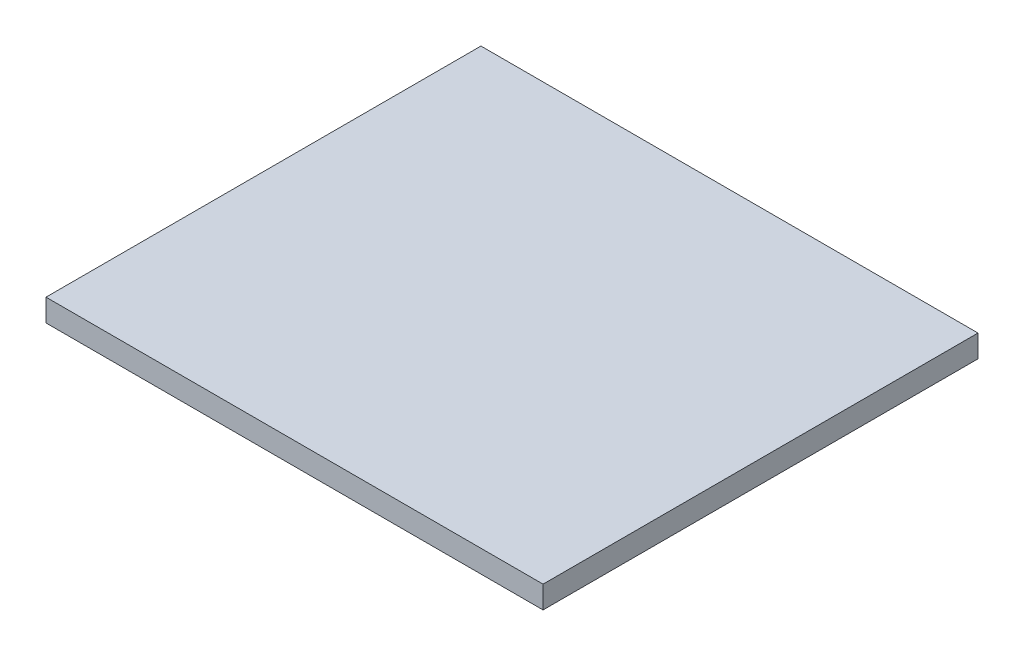
ISO-10303-21;
HEADER;
FILE_DESCRIPTION(('STEP AP214'),'2;1');
FILE_NAME('part.step','',(''),(''),'','','');
FILE_SCHEMA(('AUTOMOTIVE_DESIGN { 1 0 10303 214 1 1 1 1 }'));
ENDSEC;
DATA;
#1=APPLICATION_CONTEXT('core data for automotive mechanical design processes');
#2=APPLICATION_PROTOCOL_DEFINITION('international standard','automotive_design',2000,#1);
#3=PRODUCT_CONTEXT('',#1,'mechanical');
#4=PRODUCT('Part','Part','',(#3));
#5=PRODUCT_RELATED_PRODUCT_CATEGORY('part','',(#4));
#6=PRODUCT_DEFINITION_FORMATION('','',#4);
#7=PRODUCT_DEFINITION_CONTEXT('part definition',#1,'design');
#8=PRODUCT_DEFINITION('design','',#6,#7);
#9=PRODUCT_DEFINITION_SHAPE('','',#8);
#10=(LENGTH_UNIT() NAMED_UNIT(*) SI_UNIT(.MILLI.,.METRE.));
#11=(NAMED_UNIT(*) PLANE_ANGLE_UNIT() SI_UNIT($,.RADIAN.));
#12=(NAMED_UNIT(*) SI_UNIT($,.STERADIAN.) SOLID_ANGLE_UNIT());
#13=UNCERTAINTY_MEASURE_WITH_UNIT(LENGTH_MEASURE(1.E-05),#10,'distance_accuracy_value','');
#14=(GEOMETRIC_REPRESENTATION_CONTEXT(3) GLOBAL_UNCERTAINTY_ASSIGNED_CONTEXT((#13)) GLOBAL_UNIT_ASSIGNED_CONTEXT((#10,
#11,#12)) REPRESENTATION_CONTEXT('',''));
#15=CARTESIAN_POINT('',(0.,0.,0.));
#16=DIRECTION('',(0.,0.,1.));
#17=DIRECTION('',(1.,0.,0.));
#18=AXIS2_PLACEMENT_3D('',#15,#16,#17);
#19=CARTESIAN_POINT('',(200.,18.,-175.));
#20=DIRECTION('',(-1.,0.,0.));
#21=DIRECTION('',(0.,0.,1.));
#22=AXIS2_PLACEMENT_3D('',#19,#20,#21);
#23=PLANE('',#22);
#24=DIRECTION('',(0.,0.,-1.));
#25=VECTOR('',#24,1.);
#26=CARTESIAN_POINT('',(200.,0.,-175.));
#27=LINE('',#26,#25);
#28=CARTESIAN_POINT('',(200.,0.,175.));
#29=VERTEX_POINT('',#28);
#30=CARTESIAN_POINT('',(200.,0.,-175.));
#31=VERTEX_POINT('',#30);
#32=EDGE_CURVE('E96',#29,#31,#27,.T.);
#33=ORIENTED_EDGE('',*,*,#32,.T.);
#34=DIRECTION('',(0.,-1.,0.));
#35=VECTOR('',#34,1.);
#36=CARTESIAN_POINT('',(200.,18.,-175.));
#37=LINE('',#36,#35);
#38=CARTESIAN_POINT('',(200.,18.,-175.));
#39=VERTEX_POINT('',#38);
#40=EDGE_CURVE('E11',#39,#31,#37,.T.);
#41=ORIENTED_EDGE('',*,*,#40,.F.);
#42=DIRECTION('',(0.,0.,-1.));
#43=VECTOR('',#42,1.);
#44=CARTESIAN_POINT('',(200.,18.,-175.));
#45=LINE('',#44,#43);
#46=CARTESIAN_POINT('',(200.,18.,175.));
#47=VERTEX_POINT('',#46);
#48=EDGE_CURVE('E84',#47,#39,#45,.T.);
#49=ORIENTED_EDGE('',*,*,#48,.F.);
#50=DIRECTION('',(0.,-1.,0.));
#51=VECTOR('',#50,1.);
#52=CARTESIAN_POINT('',(200.,18.,175.));
#53=LINE('',#52,#51);
#54=EDGE_CURVE('E92',#47,#29,#53,.T.);
#55=ORIENTED_EDGE('',*,*,#54,.T.);
#56=EDGE_LOOP('',(#33,#41,#49,#55));
#57=FACE_BOUND('',#56,.T.);
#58=ADVANCED_FACE('F33',(#57),#23,.F.);
#59=CARTESIAN_POINT('',(-200.,18.,-175.));
#60=DIRECTION('',(0.,0.,1.));
#61=DIRECTION('',(1.,0.,0.));
#62=AXIS2_PLACEMENT_3D('',#59,#60,#61);
#63=PLANE('',#62);
#64=DIRECTION('',(-1.,0.,0.));
#65=VECTOR('',#64,1.);
#66=CARTESIAN_POINT('',(-200.,0.,-175.));
#67=LINE('',#66,#65);
#68=CARTESIAN_POINT('',(-200.,0.,-175.));
#69=VERTEX_POINT('',#68);
#70=EDGE_CURVE('E88',#31,#69,#67,.T.);
#71=ORIENTED_EDGE('',*,*,#70,.T.);
#72=DIRECTION('',(0.,-1.,0.));
#73=VECTOR('',#72,1.);
#74=CARTESIAN_POINT('',(-200.,18.,-175.));
#75=LINE('',#74,#73);
#76=CARTESIAN_POINT('',(-200.,18.,-175.));
#77=VERTEX_POINT('',#76);
#78=EDGE_CURVE('E41',#77,#69,#75,.T.);
#79=ORIENTED_EDGE('',*,*,#78,.F.);
#80=DIRECTION('',(-1.,0.,0.));
#81=VECTOR('',#80,1.);
#82=CARTESIAN_POINT('',(-200.,18.,-175.));
#83=LINE('',#82,#81);
#84=EDGE_CURVE('E79',#39,#77,#83,.T.);
#85=ORIENTED_EDGE('',*,*,#84,.F.);
#86=ORIENTED_EDGE('',*,*,#40,.T.);
#87=EDGE_LOOP('',(#71,#79,#85,#86));
#88=FACE_BOUND('',#87,.T.);
#89=ADVANCED_FACE('F87',(#88),#63,.F.);
#90=CARTESIAN_POINT('',(-200.,18.,-175.));
#91=DIRECTION('',(1.,0.,0.));
#92=DIRECTION('',(0.,0.,-1.));
#93=AXIS2_PLACEMENT_3D('',#90,#91,#92);
#94=PLANE('',#93);
#95=DIRECTION('',(0.,0.,1.));
#96=VECTOR('',#95,1.);
#97=CARTESIAN_POINT('',(-200.,0.,-175.));
#98=LINE('',#97,#96);
#99=CARTESIAN_POINT('',(-200.,0.,175.));
#100=VERTEX_POINT('',#99);
#101=EDGE_CURVE('E66',#69,#100,#98,.T.);
#102=ORIENTED_EDGE('',*,*,#101,.T.);
#103=DIRECTION('',(0.,-1.,0.));
#104=VECTOR('',#103,1.);
#105=CARTESIAN_POINT('',(-200.,18.,175.));
#106=LINE('',#105,#104);
#107=CARTESIAN_POINT('',(-200.,18.,175.));
#108=VERTEX_POINT('',#107);
#109=EDGE_CURVE('E89',#108,#100,#106,.T.);
#110=ORIENTED_EDGE('',*,*,#109,.F.);
#111=DIRECTION('',(0.,0.,1.));
#112=VECTOR('',#111,1.);
#113=CARTESIAN_POINT('',(-200.,18.,-175.));
#114=LINE('',#113,#112);
#115=EDGE_CURVE('E82',#77,#108,#114,.T.);
#116=ORIENTED_EDGE('',*,*,#115,.F.);
#117=ORIENTED_EDGE('',*,*,#78,.T.);
#118=EDGE_LOOP('',(#102,#110,#116,#117));
#119=FACE_BOUND('',#118,.T.);
#120=ADVANCED_FACE('F90',(#119),#94,.F.);
#121=CARTESIAN_POINT('',(-200.,18.,175.));
#122=DIRECTION('',(0.,0.,-1.));
#123=DIRECTION('',(-1.,0.,0.));
#124=AXIS2_PLACEMENT_3D('',#121,#122,#123);
#125=PLANE('',#124);
#126=DIRECTION('',(1.,0.,0.));
#127=VECTOR('',#126,1.);
#128=CARTESIAN_POINT('',(-200.,0.,175.));
#129=LINE('',#128,#127);
#130=EDGE_CURVE('E72',#100,#29,#129,.T.);
#131=ORIENTED_EDGE('',*,*,#130,.T.);
#132=ORIENTED_EDGE('',*,*,#54,.F.);
#133=DIRECTION('',(1.,0.,0.));
#134=VECTOR('',#133,1.);
#135=CARTESIAN_POINT('',(-200.,18.,175.));
#136=LINE('',#135,#134);
#137=EDGE_CURVE('E49',#108,#47,#136,.T.);
#138=ORIENTED_EDGE('',*,*,#137,.F.);
#139=ORIENTED_EDGE('',*,*,#109,.T.);
#140=EDGE_LOOP('',(#131,#132,#138,#139));
#141=FACE_BOUND('',#140,.T.);
#142=ADVANCED_FACE('F103',(#141),#125,.F.);
#143=CARTESIAN_POINT('',(0.,18.,0.));
#144=DIRECTION('',(0.,1.,0.));
#145=DIRECTION('',(0.,0.,1.));
#146=AXIS2_PLACEMENT_3D('',#143,#144,#145);
#147=PLANE('',#146);
#148=ORIENTED_EDGE('',*,*,#48,.T.);
#149=ORIENTED_EDGE('',*,*,#84,.T.);
#150=ORIENTED_EDGE('',*,*,#115,.T.);
#151=ORIENTED_EDGE('',*,*,#137,.T.);
#152=EDGE_LOOP('',(#148,#149,#150,#151));
#153=FACE_BOUND('',#152,.T.);
#154=ADVANCED_FACE('F80',(#153),#147,.T.);
#155=CARTESIAN_POINT('',(0.,0.,0.));
#156=DIRECTION('',(0.,1.,0.));
#157=DIRECTION('',(0.,0.,1.));
#158=AXIS2_PLACEMENT_3D('',#155,#156,#157);
#159=PLANE('',#158);
#160=ORIENTED_EDGE('',*,*,#32,.F.);
#161=ORIENTED_EDGE('',*,*,#130,.F.);
#162=ORIENTED_EDGE('',*,*,#101,.F.);
#163=ORIENTED_EDGE('',*,*,#70,.F.);
#164=EDGE_LOOP('',(#160,#161,#162,#163));
#165=FACE_BOUND('',#164,.T.);
#166=ADVANCED_FACE('F106',(#165),#159,.F.);
#167=CLOSED_SHELL('',(#58,#89,#120,#142,#154,#166));
#168=MANIFOLD_SOLID_BREP('B2',#167);
#169=ADVANCED_BREP_SHAPE_REPRESENTATION('',(#18,#168),#14);
#170=SHAPE_DEFINITION_REPRESENTATION(#9,#169);
ENDSEC;
END-ISO-10303-21;
